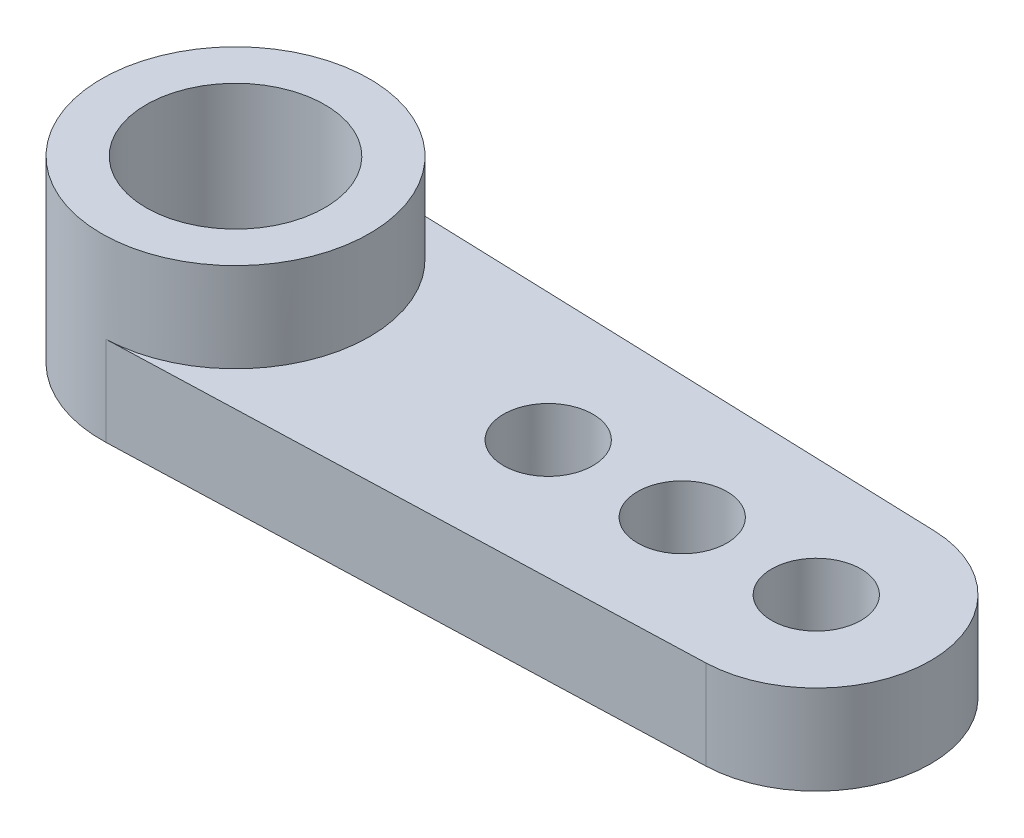
ISO-10303-21;
HEADER;
FILE_DESCRIPTION(('STEP AP214'),'2;1');
FILE_NAME('part.step','',(''),(''),'','','');
FILE_SCHEMA(('AUTOMOTIVE_DESIGN { 1 0 10303 214 1 1 1 1 }'));
ENDSEC;
DATA;
#1=APPLICATION_CONTEXT('core data for automotive mechanical design processes');
#2=APPLICATION_PROTOCOL_DEFINITION('international standard','automotive_design',2000,#1);
#3=PRODUCT_CONTEXT('',#1,'mechanical');
#4=PRODUCT('Part','Part','',(#3));
#5=PRODUCT_RELATED_PRODUCT_CATEGORY('part','',(#4));
#6=PRODUCT_DEFINITION_FORMATION('','',#4);
#7=PRODUCT_DEFINITION_CONTEXT('part definition',#1,'design');
#8=PRODUCT_DEFINITION('design','',#6,#7);
#9=PRODUCT_DEFINITION_SHAPE('','',#8);
#10=(LENGTH_UNIT() NAMED_UNIT(*) SI_UNIT(.MILLI.,.METRE.));
#11=(NAMED_UNIT(*) PLANE_ANGLE_UNIT() SI_UNIT($,.RADIAN.));
#12=(NAMED_UNIT(*) SI_UNIT($,.STERADIAN.) SOLID_ANGLE_UNIT());
#13=UNCERTAINTY_MEASURE_WITH_UNIT(LENGTH_MEASURE(1.E-05),#10,'distance_accuracy_value','');
#14=(GEOMETRIC_REPRESENTATION_CONTEXT(3) GLOBAL_UNCERTAINTY_ASSIGNED_CONTEXT((#13)) GLOBAL_UNIT_ASSIGNED_CONTEXT((#10,
#11,#12)) REPRESENTATION_CONTEXT('',''));
#15=CARTESIAN_POINT('',(0.,0.,0.));
#16=DIRECTION('',(0.,0.,1.));
#17=DIRECTION('',(1.,0.,0.));
#18=AXIS2_PLACEMENT_3D('',#15,#16,#17);
#19=CARTESIAN_POINT('',(-28.3865492729134,2.,-0.00171798444882968));
#20=DIRECTION('',(0.,-1.,0.));
#21=DIRECTION('',(0.,0.,-1.));
#22=AXIS2_PLACEMENT_3D('',#19,#20,#21);
#23=PLANE('',#22);
#24=CARTESIAN_POINT('',(-28.3865492729134,2.,-0.00171798444882981));
#25=DIRECTION('',(0.,1.,0.));
#26=DIRECTION('',(0.,0.,1.));
#27=AXIS2_PLACEMENT_3D('',#24,#25,#26);
#28=CIRCLE('',#27,1.);
#29=CARTESIAN_POINT('',(-28.3865492729134,2.,0.998282015551172));
#30=VERTEX_POINT('',#29);
#31=EDGE_CURVE('E102',#30,#30,#28,.T.);
#32=ORIENTED_EDGE('',*,*,#31,.F.);
#33=EDGE_LOOP('',(#32));
#34=FACE_BOUND('',#33,.T.);
#35=CARTESIAN_POINT('',(-31.3865492729134,2.,-0.00171798444882981));
#36=DIRECTION('',(0.,1.,0.));
#37=DIRECTION('',(0.,0.,1.));
#38=AXIS2_PLACEMENT_3D('',#35,#36,#37);
#39=CIRCLE('',#38,0.999999999999998);
#40=CARTESIAN_POINT('',(-31.3865492729134,2.,0.998282015551168));
#41=VERTEX_POINT('',#40);
#42=EDGE_CURVE('E133',#41,#41,#39,.T.);
#43=ORIENTED_EDGE('',*,*,#42,.F.);
#44=EDGE_LOOP('',(#43));
#45=FACE_BOUND('',#44,.T.);
#46=CARTESIAN_POINT('',(-34.3865492729134,2.,-0.00171798444882981));
#47=DIRECTION('',(0.,1.,0.));
#48=DIRECTION('',(0.,0.,1.));
#49=AXIS2_PLACEMENT_3D('',#46,#47,#48);
#50=CIRCLE('',#49,0.999999999999998);
#51=CARTESIAN_POINT('',(-34.3865492729134,2.,0.998282015551168));
#52=VERTEX_POINT('',#51);
#53=EDGE_CURVE('E126',#52,#52,#50,.T.);
#54=ORIENTED_EDGE('',*,*,#53,.F.);
#55=EDGE_LOOP('',(#54));
#56=FACE_BOUND('',#55,.T.);
#57=CARTESIAN_POINT('',(-41.3865492729134,2.,-0.00171798444883001));
#58=DIRECTION('',(0.,1.,0.));
#59=DIRECTION('',(0.,0.,1.));
#60=AXIS2_PLACEMENT_3D('',#57,#58,#59);
#61=CIRCLE('',#60,3.);
#62=CARTESIAN_POINT('',(-41.2850068603521,2.,2.99656304615041));
#63=VERTEX_POINT('',#62);
#64=CARTESIAN_POINT('',(-41.2850068603521,2.,-2.99999901504807));
#65=VERTEX_POINT('',#64);
#66=EDGE_CURVE('E89',#63,#65,#61,.T.);
#67=ORIENTED_EDGE('',*,*,#66,.F.);
#68=DIRECTION('',(0.999427010199746,0.,-0.0338474708537792));
#69=VECTOR('',#68,1.);
#70=CARTESIAN_POINT('',(-41.2850068603521,2.,2.99656304615041));
#71=LINE('',#70,#69);
#72=CARTESIAN_POINT('',(-28.2999003270337,2.,2.55679805037361));
#73=VERTEX_POINT('',#72);
#74=EDGE_CURVE('E50',#63,#73,#71,.T.);
#75=ORIENTED_EDGE('',*,*,#74,.T.);
#76=CARTESIAN_POINT('',(-28.3865492729134,2.,-0.00171798444882968));
#77=DIRECTION('',(0.,1.,0.));
#78=DIRECTION('',(0.,0.,-1.));
#79=AXIS2_PLACEMENT_3D('',#76,#77,#78);
#80=CIRCLE('',#79,2.55998287890087);
#81=CARTESIAN_POINT('',(-28.2999003270337,2.,-2.56023401927127));
#82=VERTEX_POINT('',#81);
#83=EDGE_CURVE('E112',#73,#82,#80,.T.);
#84=ORIENTED_EDGE('',*,*,#83,.T.);
#85=DIRECTION('',(-0.999427010199746,0.,-0.0338474708537792));
#86=VECTOR('',#85,1.);
#87=CARTESIAN_POINT('',(-41.2850068603521,2.,-2.99999901504807));
#88=LINE('',#87,#86);
#89=EDGE_CURVE('E79',#82,#65,#88,.T.);
#90=ORIENTED_EDGE('',*,*,#89,.T.);
#91=EDGE_LOOP('',(#67,#75,#84,#90));
#92=FACE_BOUND('',#91,.T.);
#93=ADVANCED_FACE('F31',(#34,#45,#56,#92),#23,.F.);
#94=CARTESIAN_POINT('',(-28.3865492729134,2.,-0.00171798444882968));
#95=DIRECTION('',(0.,-1.,0.));
#96=DIRECTION('',(0.,0.,-1.));
#97=AXIS2_PLACEMENT_3D('',#94,#95,#96);
#98=CYLINDRICAL_SURFACE('',#97,2.55998287890087);
#99=CARTESIAN_POINT('',(-28.3865492729134,0.,-0.00171798444882968));
#100=DIRECTION('',(0.,1.,0.));
#101=DIRECTION('',(0.,0.,-1.));
#102=AXIS2_PLACEMENT_3D('',#99,#100,#101);
#103=CIRCLE('',#102,2.55998287890087);
#104=CARTESIAN_POINT('',(-28.2999003270337,0.,2.55679805037361));
#105=VERTEX_POINT('',#104);
#106=CARTESIAN_POINT('',(-28.2999003270337,0.,-2.56023401927127));
#107=VERTEX_POINT('',#106);
#108=EDGE_CURVE('E120',#105,#107,#103,.T.);
#109=ORIENTED_EDGE('',*,*,#108,.T.);
#110=DIRECTION('',(0.,-1.,0.));
#111=VECTOR('',#110,1.);
#112=CARTESIAN_POINT('',(-28.2999003270337,2.,-2.56023401927127));
#113=LINE('',#112,#111);
#114=EDGE_CURVE('E11',#82,#107,#113,.T.);
#115=ORIENTED_EDGE('',*,*,#114,.F.);
#116=ORIENTED_EDGE('',*,*,#83,.F.);
#117=DIRECTION('',(0.,-1.,0.));
#118=VECTOR('',#117,1.);
#119=CARTESIAN_POINT('',(-28.2999003270337,2.,2.55679805037361));
#120=LINE('',#119,#118);
#121=EDGE_CURVE('E83',#73,#105,#120,.T.);
#122=ORIENTED_EDGE('',*,*,#121,.T.);
#123=EDGE_LOOP('',(#109,#115,#116,#122));
#124=FACE_BOUND('',#123,.T.);
#125=ADVANCED_FACE('F33',(#124),#98,.T.);
#126=CARTESIAN_POINT('',(-41.2850068603521,2.,-2.99999901504807));
#127=DIRECTION('',(-0.0338474708537792,0.,0.999427010199746));
#128=DIRECTION('',(0.999427010199746,0.,0.0338474708537792));
#129=AXIS2_PLACEMENT_3D('',#126,#127,#128);
#130=PLANE('',#129);
#131=DIRECTION('',(-0.999427010199746,0.,-0.0338474708537792));
#132=VECTOR('',#131,1.);
#133=CARTESIAN_POINT('',(-41.2850068603521,0.,-2.99999901504807));
#134=LINE('',#133,#132);
#135=CARTESIAN_POINT('',(-41.2850068603521,0.,-2.99999901504807));
#136=VERTEX_POINT('',#135);
#137=EDGE_CURVE('E117',#107,#136,#134,.T.);
#138=ORIENTED_EDGE('',*,*,#137,.T.);
#139=DIRECTION('',(0.,-1.,0.));
#140=VECTOR('',#139,1.);
#141=CARTESIAN_POINT('',(-41.2850068603521,2.,-2.99999901504807));
#142=LINE('',#141,#140);
#143=EDGE_CURVE('E41',#65,#136,#142,.T.);
#144=ORIENTED_EDGE('',*,*,#143,.F.);
#145=ORIENTED_EDGE('',*,*,#89,.F.);
#146=ORIENTED_EDGE('',*,*,#114,.T.);
#147=EDGE_LOOP('',(#138,#144,#145,#146));
#148=FACE_BOUND('',#147,.T.);
#149=ADVANCED_FACE('F172',(#148),#130,.F.);
#150=CARTESIAN_POINT('',(-41.3865492729134,2.,-0.00171798444883001));
#151=DIRECTION('',(0.,-1.,0.));
#152=DIRECTION('',(0.,0.,-1.));
#153=AXIS2_PLACEMENT_3D('',#150,#151,#152);
#154=CYLINDRICAL_SURFACE('',#153,3.);
#155=CARTESIAN_POINT('',(-41.3865492729134,0.,-0.00171798444883001));
#156=DIRECTION('',(0.,1.,0.));
#157=DIRECTION('',(0.,0.,1.));
#158=AXIS2_PLACEMENT_3D('',#155,#156,#157);
#159=CIRCLE('',#158,3.);
#160=CARTESIAN_POINT('',(-41.2850068603521,0.,2.99656304615041));
#161=VERTEX_POINT('',#160);
#162=EDGE_CURVE('E69',#136,#161,#159,.T.);
#163=ORIENTED_EDGE('',*,*,#162,.T.);
#164=DIRECTION('',(0.,-1.,0.));
#165=VECTOR('',#164,1.);
#166=CARTESIAN_POINT('',(-41.2850068603521,2.,2.99656304615041));
#167=LINE('',#166,#165);
#168=EDGE_CURVE('E82',#63,#161,#167,.T.);
#169=ORIENTED_EDGE('',*,*,#168,.F.);
#170=ORIENTED_EDGE('',*,*,#66,.T.);
#171=ORIENTED_EDGE('',*,*,#143,.T.);
#172=EDGE_LOOP('',(#163,#169,#170,#171));
#173=FACE_BOUND('',#172,.T.);
#174=CARTESIAN_POINT('',(-41.3865492729134,4.,-0.00171798444883001));
#175=DIRECTION('',(0.,1.,0.));
#176=DIRECTION('',(0.,0.,1.));
#177=AXIS2_PLACEMENT_3D('',#174,#175,#176);
#178=CIRCLE('',#177,3.);
#179=CARTESIAN_POINT('',(-41.3865492729134,4.,2.99828201555117));
#180=VERTEX_POINT('',#179);
#181=EDGE_CURVE('E91',#180,#180,#178,.T.);
#182=ORIENTED_EDGE('',*,*,#181,.F.);
#183=EDGE_LOOP('',(#182));
#184=FACE_BOUND('',#183,.T.);
#185=ADVANCED_FACE('F87',(#173,#184),#154,.T.);
#186=CARTESIAN_POINT('',(-41.2850068603521,2.,2.99656304615041));
#187=DIRECTION('',(-0.0338474708537792,0.,-0.999427010199746));
#188=DIRECTION('',(-0.999427010199746,0.,0.0338474708537792));
#189=AXIS2_PLACEMENT_3D('',#186,#187,#188);
#190=PLANE('',#189);
#191=DIRECTION('',(0.999427010199746,0.,-0.0338474708537792));
#192=VECTOR('',#191,1.);
#193=CARTESIAN_POINT('',(-41.2850068603521,0.,2.99656304615041));
#194=LINE('',#193,#192);
#195=EDGE_CURVE('E74',#161,#105,#194,.T.);
#196=ORIENTED_EDGE('',*,*,#195,.T.);
#197=ORIENTED_EDGE('',*,*,#121,.F.);
#198=ORIENTED_EDGE('',*,*,#74,.F.);
#199=ORIENTED_EDGE('',*,*,#168,.T.);
#200=EDGE_LOOP('',(#196,#197,#198,#199));
#201=FACE_BOUND('',#200,.T.);
#202=ADVANCED_FACE('F81',(#201),#190,.F.);
#203=CARTESIAN_POINT('',(-28.3865492729134,0.,-0.00171798444882968));
#204=DIRECTION('',(0.,-1.,0.));
#205=DIRECTION('',(0.,0.,-1.));
#206=AXIS2_PLACEMENT_3D('',#203,#204,#205);
#207=PLANE('',#206);
#208=CARTESIAN_POINT('',(-28.3865492729134,0.,-0.00171798444882981));
#209=DIRECTION('',(0.,-1.,0.));
#210=DIRECTION('',(0.,0.,-1.));
#211=AXIS2_PLACEMENT_3D('',#208,#209,#210);
#212=CIRCLE('',#211,1.);
#213=CARTESIAN_POINT('',(-28.3865492729134,0.,-1.00171798444883));
#214=VERTEX_POINT('',#213);
#215=EDGE_CURVE('E95',#214,#214,#212,.F.);
#216=ORIENTED_EDGE('',*,*,#215,.T.);
#217=EDGE_LOOP('',(#216));
#218=FACE_BOUND('',#217,.T.);
#219=CARTESIAN_POINT('',(-31.3865492729134,0.,-0.00171798444882981));
#220=DIRECTION('',(0.,-1.,0.));
#221=DIRECTION('',(0.,0.,-1.));
#222=AXIS2_PLACEMENT_3D('',#219,#220,#221);
#223=CIRCLE('',#222,0.999999999999998);
#224=CARTESIAN_POINT('',(-31.3865492729134,0.,-1.00171798444883));
#225=VERTEX_POINT('',#224);
#226=EDGE_CURVE('E135',#225,#225,#223,.F.);
#227=ORIENTED_EDGE('',*,*,#226,.T.);
#228=EDGE_LOOP('',(#227));
#229=FACE_BOUND('',#228,.T.);
#230=CARTESIAN_POINT('',(-34.3865492729134,0.,-0.00171798444882981));
#231=DIRECTION('',(0.,-1.,0.));
#232=DIRECTION('',(0.,0.,-1.));
#233=AXIS2_PLACEMENT_3D('',#230,#231,#232);
#234=CIRCLE('',#233,0.999999999999998);
#235=CARTESIAN_POINT('',(-34.3865492729134,0.,-1.00171798444883));
#236=VERTEX_POINT('',#235);
#237=EDGE_CURVE('E128',#236,#236,#234,.F.);
#238=ORIENTED_EDGE('',*,*,#237,.T.);
#239=EDGE_LOOP('',(#238));
#240=FACE_BOUND('',#239,.T.);
#241=ORIENTED_EDGE('',*,*,#108,.F.);
#242=ORIENTED_EDGE('',*,*,#195,.F.);
#243=ORIENTED_EDGE('',*,*,#162,.F.);
#244=ORIENTED_EDGE('',*,*,#137,.F.);
#245=EDGE_LOOP('',(#241,#242,#243,#244));
#246=FACE_BOUND('',#245,.T.);
#247=ADVANCED_FACE('F116',(#218,#229,#240,#246),#207,.T.);
#248=CARTESIAN_POINT('',(-34.3865492729134,-0.00100000000000013,-0.00171798444882981));
#249=DIRECTION('',(0.,1.,0.));
#250=DIRECTION('',(0.,0.,1.));
#251=AXIS2_PLACEMENT_3D('',#248,#249,#250);
#252=CYLINDRICAL_SURFACE('',#251,0.999999999999998);
#253=ORIENTED_EDGE('',*,*,#237,.F.);
#254=EDGE_LOOP('',(#253));
#255=FACE_BOUND('',#254,.T.);
#256=ORIENTED_EDGE('',*,*,#53,.T.);
#257=EDGE_LOOP('',(#256));
#258=FACE_BOUND('',#257,.T.);
#259=ADVANCED_FACE('F154',(#255,#258),#252,.F.);
#260=CARTESIAN_POINT('',(-31.3865492729134,-0.00100000000000013,-0.00171798444882981));
#261=DIRECTION('',(0.,1.,0.));
#262=DIRECTION('',(0.,0.,1.));
#263=AXIS2_PLACEMENT_3D('',#260,#261,#262);
#264=CYLINDRICAL_SURFACE('',#263,0.999999999999998);
#265=ORIENTED_EDGE('',*,*,#226,.F.);
#266=EDGE_LOOP('',(#265));
#267=FACE_BOUND('',#266,.T.);
#268=ORIENTED_EDGE('',*,*,#42,.T.);
#269=EDGE_LOOP('',(#268));
#270=FACE_BOUND('',#269,.T.);
#271=ADVANCED_FACE('F156',(#267,#270),#264,.F.);
#272=CARTESIAN_POINT('',(-28.3865492729134,-0.00100000000000013,-0.00171798444882981));
#273=DIRECTION('',(0.,1.,0.));
#274=DIRECTION('',(0.,0.,1.));
#275=AXIS2_PLACEMENT_3D('',#272,#273,#274);
#276=CYLINDRICAL_SURFACE('',#275,1.);
#277=ORIENTED_EDGE('',*,*,#215,.F.);
#278=EDGE_LOOP('',(#277));
#279=FACE_BOUND('',#278,.T.);
#280=ORIENTED_EDGE('',*,*,#31,.T.);
#281=EDGE_LOOP('',(#280));
#282=FACE_BOUND('',#281,.T.);
#283=ADVANCED_FACE('F145',(#279,#282),#276,.F.);
#284=CARTESIAN_POINT('',(-41.3865492729134,4.,-0.00171798444883001));
#285=DIRECTION('',(0.,1.,0.));
#286=DIRECTION('',(0.,0.,1.));
#287=AXIS2_PLACEMENT_3D('',#284,#285,#286);
#288=PLANE('',#287);
#289=ORIENTED_EDGE('',*,*,#181,.T.);
#290=EDGE_LOOP('',(#289));
#291=FACE_BOUND('',#290,.T.);
#292=CARTESIAN_POINT('',(-41.3865492729134,4.,-0.00171798444883001));
#293=DIRECTION('',(0.,1.,0.));
#294=DIRECTION('',(0.,0.,1.));
#295=AXIS2_PLACEMENT_3D('',#292,#293,#294);
#296=CIRCLE('',#295,2.);
#297=CARTESIAN_POINT('',(-41.3865492729134,4.,1.99828201555117));
#298=VERTEX_POINT('',#297);
#299=EDGE_CURVE('E92',#298,#298,#296,.T.);
#300=ORIENTED_EDGE('',*,*,#299,.F.);
#301=EDGE_LOOP('',(#300));
#302=FACE_BOUND('',#301,.T.);
#303=ADVANCED_FACE('F213',(#291,#302),#288,.T.);
#304=CARTESIAN_POINT('',(-41.3865492729134,4.,-0.00171798444883001));
#305=DIRECTION('',(0.,-1.,0.));
#306=DIRECTION('',(0.,0.,-1.));
#307=AXIS2_PLACEMENT_3D('',#304,#305,#306);
#308=CYLINDRICAL_SURFACE('',#307,2.);
#309=ORIENTED_EDGE('',*,*,#299,.T.);
#310=EDGE_LOOP('',(#309));
#311=FACE_BOUND('',#310,.T.);
#312=CARTESIAN_POINT('',(-41.3865492729134,1.,-0.00171798444883001));
#313=DIRECTION('',(0.,1.,0.));
#314=DIRECTION('',(0.,0.,1.));
#315=AXIS2_PLACEMENT_3D('',#312,#313,#314);
#316=CIRCLE('',#315,2.);
#317=CARTESIAN_POINT('',(-41.3865492729134,1.,1.99828201555117));
#318=VERTEX_POINT('',#317);
#319=EDGE_CURVE('E98',#318,#318,#316,.T.);
#320=ORIENTED_EDGE('',*,*,#319,.F.);
#321=EDGE_LOOP('',(#320));
#322=FACE_BOUND('',#321,.T.);
#323=ADVANCED_FACE('F217',(#311,#322),#308,.F.);
#324=CARTESIAN_POINT('',(-41.3865492729134,1.,-0.00171798444883001));
#325=DIRECTION('',(0.,1.,0.));
#326=DIRECTION('',(0.,0.,1.));
#327=AXIS2_PLACEMENT_3D('',#324,#325,#326);
#328=PLANE('',#327);
#329=ORIENTED_EDGE('',*,*,#319,.T.);
#330=EDGE_LOOP('',(#329));
#331=FACE_BOUND('',#330,.T.);
#332=ADVANCED_FACE('F228',(#331),#328,.T.);
#333=CLOSED_SHELL('',(#93,#125,#149,#185,#202,#247,#259,#271,#283,#303,#323,#332));
#334=MANIFOLD_SOLID_BREP('B2',#333);
#335=ADVANCED_BREP_SHAPE_REPRESENTATION('',(#18,#334),#14);
#336=SHAPE_DEFINITION_REPRESENTATION(#9,#335);
ENDSEC;
END-ISO-10303-21;
